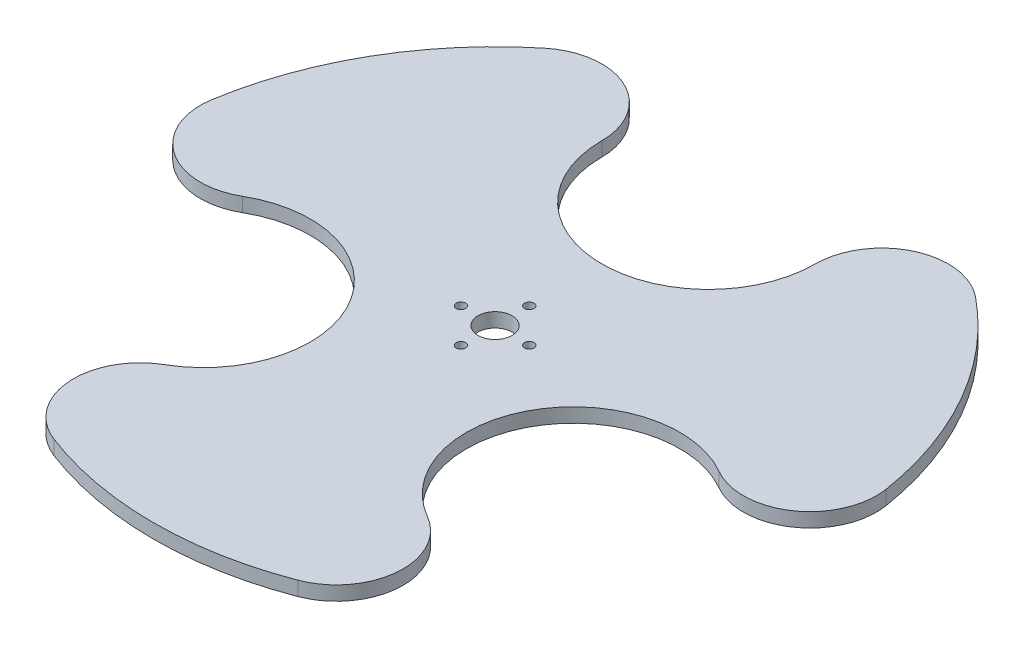
ISO-10303-21;
HEADER;
FILE_DESCRIPTION(('STEP AP214'),'2;1');
FILE_NAME('part.step','',(''),(''),'','','');
FILE_SCHEMA(('AUTOMOTIVE_DESIGN { 1 0 10303 214 1 1 1 1 }'));
ENDSEC;
DATA;
#1=APPLICATION_CONTEXT('core data for automotive mechanical design processes');
#2=APPLICATION_PROTOCOL_DEFINITION('international standard','automotive_design',2000,#1);
#3=PRODUCT_CONTEXT('',#1,'mechanical');
#4=PRODUCT('Part','Part','',(#3));
#5=PRODUCT_RELATED_PRODUCT_CATEGORY('part','',(#4));
#6=PRODUCT_DEFINITION_FORMATION('','',#4);
#7=PRODUCT_DEFINITION_CONTEXT('part definition',#1,'design');
#8=PRODUCT_DEFINITION('design','',#6,#7);
#9=PRODUCT_DEFINITION_SHAPE('','',#8);
#10=(LENGTH_UNIT() NAMED_UNIT(*) SI_UNIT(.MILLI.,.METRE.));
#11=(NAMED_UNIT(*) PLANE_ANGLE_UNIT() SI_UNIT($,.RADIAN.));
#12=(NAMED_UNIT(*) SI_UNIT($,.STERADIAN.) SOLID_ANGLE_UNIT());
#13=UNCERTAINTY_MEASURE_WITH_UNIT(LENGTH_MEASURE(1.E-05),#10,'distance_accuracy_value','');
#14=(GEOMETRIC_REPRESENTATION_CONTEXT(3) GLOBAL_UNCERTAINTY_ASSIGNED_CONTEXT((#13)) GLOBAL_UNIT_ASSIGNED_CONTEXT((#10,
#11,#12)) REPRESENTATION_CONTEXT('',''));
#15=CARTESIAN_POINT('',(0.,0.,0.));
#16=DIRECTION('',(0.,0.,1.));
#17=DIRECTION('',(1.,0.,0.));
#18=AXIS2_PLACEMENT_3D('',#15,#16,#17);
#19=CARTESIAN_POINT('',(0.,-5.,0.));
#20=DIRECTION('',(0.,1.,0.));
#21=DIRECTION('',(0.,0.,1.));
#22=AXIS2_PLACEMENT_3D('',#19,#20,#21);
#23=CYLINDRICAL_SURFACE('',#22,120.);
#24=CARTESIAN_POINT('',(0.,0.,0.));
#25=DIRECTION('',(0.,1.,0.));
#26=DIRECTION('',(0.,0.,1.));
#27=AXIS2_PLACEMENT_3D('',#24,#25,#26);
#28=CIRCLE('',#27,120.);
#29=CARTESIAN_POINT('',(-75.6377079482441,0.,-93.1608133086874));
#30=VERTEX_POINT('',#29);
#31=CARTESIAN_POINT('',(-118.498484936665,0.,-18.9237699128637));
#32=VERTEX_POINT('',#31);
#33=EDGE_CURVE('E166',#30,#32,#28,.T.);
#34=ORIENTED_EDGE('',*,*,#33,.F.);
#35=DIRECTION('',(0.,1.,0.));
#36=VECTOR('',#35,1.);
#37=CARTESIAN_POINT('',(-75.6377079482441,-5.,-93.1608133086874));
#38=LINE('',#37,#36);
#39=CARTESIAN_POINT('',(-75.6377079482441,-5.,-93.1608133086874));
#40=VERTEX_POINT('',#39);
#41=EDGE_CURVE('E11',#40,#30,#38,.T.);
#42=ORIENTED_EDGE('',*,*,#41,.F.);
#43=CARTESIAN_POINT('',(0.,-5.,0.));
#44=DIRECTION('',(0.,1.,0.));
#45=DIRECTION('',(0.,0.,1.));
#46=AXIS2_PLACEMENT_3D('',#43,#44,#45);
#47=CIRCLE('',#46,120.);
#48=CARTESIAN_POINT('',(-118.498484936665,-5.,-18.9237699128637));
#49=VERTEX_POINT('',#48);
#50=EDGE_CURVE('E217',#40,#49,#47,.T.);
#51=ORIENTED_EDGE('',*,*,#50,.T.);
#52=DIRECTION('',(0.,1.,0.));
#53=VECTOR('',#52,1.);
#54=CARTESIAN_POINT('',(-118.498484936665,-5.,-18.9237699128637));
#55=LINE('',#54,#53);
#56=EDGE_CURVE('E43',#49,#32,#55,.T.);
#57=ORIENTED_EDGE('',*,*,#56,.T.);
#58=EDGE_LOOP('',(#34,#42,#51,#57));
#59=FACE_BOUND('',#58,.T.);
#60=ADVANCED_FACE('F39',(#59),#23,.T.);
#61=CARTESIAN_POINT('',(-60.8928571428574,-5.,-75.));
#62=DIRECTION('',(0.,1.,0.));
#63=DIRECTION('',(0.,0.,1.));
#64=AXIS2_PLACEMENT_3D('',#61,#62,#63);
#65=CYLINDRICAL_SURFACE('',#64,23.3928571428571);
#66=CARTESIAN_POINT('',(-60.8928571428574,0.,-75.));
#67=DIRECTION('',(0.,1.,0.));
#68=DIRECTION('',(0.,0.,1.));
#69=AXIS2_PLACEMENT_3D('',#66,#67,#68);
#70=CIRCLE('',#69,23.3928571428571);
#71=CARTESIAN_POINT('',(-37.5,0.,-75.));
#72=VERTEX_POINT('',#71);
#73=EDGE_CURVE('E197',#30,#72,#70,.F.);
#74=ORIENTED_EDGE('',*,*,#73,.T.);
#75=DIRECTION('',(0.,1.,0.));
#76=VECTOR('',#75,1.);
#77=CARTESIAN_POINT('',(-37.5,-5.,-75.));
#78=LINE('',#77,#76);
#79=CARTESIAN_POINT('',(-37.5,-5.,-75.));
#80=VERTEX_POINT('',#79);
#81=EDGE_CURVE('E49',#80,#72,#78,.T.);
#82=ORIENTED_EDGE('',*,*,#81,.F.);
#83=CARTESIAN_POINT('',(-60.8928571428574,-5.,-75.));
#84=DIRECTION('',(0.,1.,0.));
#85=DIRECTION('',(0.,0.,1.));
#86=AXIS2_PLACEMENT_3D('',#83,#84,#85);
#87=CIRCLE('',#86,23.3928571428571);
#88=EDGE_CURVE('E145',#40,#80,#87,.F.);
#89=ORIENTED_EDGE('',*,*,#88,.F.);
#90=ORIENTED_EDGE('',*,*,#41,.T.);
#91=EDGE_LOOP('',(#74,#82,#89,#90));
#92=FACE_BOUND('',#91,.T.);
#93=ADVANCED_FACE('F220',(#92),#65,.T.);
#94=CARTESIAN_POINT('',(0.,-5.,-75.));
#95=DIRECTION('',(0.,1.,0.));
#96=DIRECTION('',(0.,0.,1.));
#97=AXIS2_PLACEMENT_3D('',#94,#95,#96);
#98=CYLINDRICAL_SURFACE('',#97,37.5);
#99=CARTESIAN_POINT('',(0.,0.,-75.));
#100=DIRECTION('',(0.,1.,0.));
#101=DIRECTION('',(0.,0.,1.));
#102=AXIS2_PLACEMENT_3D('',#99,#100,#101);
#103=CIRCLE('',#102,37.5);
#104=CARTESIAN_POINT('',(37.5,0.,-75.));
#105=VERTEX_POINT('',#104);
#106=EDGE_CURVE('E98',#72,#105,#103,.T.);
#107=ORIENTED_EDGE('',*,*,#106,.T.);
#108=DIRECTION('',(0.,1.,0.));
#109=VECTOR('',#108,1.);
#110=CARTESIAN_POINT('',(37.5,-5.,-75.));
#111=LINE('',#110,#109);
#112=CARTESIAN_POINT('',(37.5,-5.,-75.));
#113=VERTEX_POINT('',#112);
#114=EDGE_CURVE('E149',#113,#105,#111,.T.);
#115=ORIENTED_EDGE('',*,*,#114,.F.);
#116=CARTESIAN_POINT('',(0.,-5.,-75.));
#117=DIRECTION('',(0.,1.,0.));
#118=DIRECTION('',(0.,0.,1.));
#119=AXIS2_PLACEMENT_3D('',#116,#117,#118);
#120=CIRCLE('',#119,37.5);
#121=EDGE_CURVE('E137',#80,#113,#120,.T.);
#122=ORIENTED_EDGE('',*,*,#121,.F.);
#123=ORIENTED_EDGE('',*,*,#81,.T.);
#124=EDGE_LOOP('',(#107,#115,#122,#123));
#125=FACE_BOUND('',#124,.T.);
#126=ADVANCED_FACE('F150',(#125),#98,.F.);
#127=CARTESIAN_POINT('',(60.8928571428572,-5.,-75.));
#128=DIRECTION('',(0.,1.,0.));
#129=DIRECTION('',(0.,0.,1.));
#130=AXIS2_PLACEMENT_3D('',#127,#128,#129);
#131=CYLINDRICAL_SURFACE('',#130,23.3928571428571);
#132=CARTESIAN_POINT('',(60.8928571428572,0.,-75.));
#133=DIRECTION('',(0.,1.,0.));
#134=DIRECTION('',(0.,0.,1.));
#135=AXIS2_PLACEMENT_3D('',#132,#133,#134);
#136=CIRCLE('',#135,23.3928571428571);
#137=CARTESIAN_POINT('',(75.637707948244,0.,-93.1608133086876));
#138=VERTEX_POINT('',#137);
#139=EDGE_CURVE('E194',#138,#105,#136,.T.);
#140=ORIENTED_EDGE('',*,*,#139,.F.);
#141=DIRECTION('',(0.,1.,0.));
#142=VECTOR('',#141,1.);
#143=CARTESIAN_POINT('',(75.637707948244,-5.,-93.1608133086876));
#144=LINE('',#143,#142);
#145=CARTESIAN_POINT('',(75.637707948244,-5.,-93.1608133086876));
#146=VERTEX_POINT('',#145);
#147=EDGE_CURVE('E153',#146,#138,#144,.T.);
#148=ORIENTED_EDGE('',*,*,#147,.F.);
#149=CARTESIAN_POINT('',(60.8928571428572,-5.,-75.));
#150=DIRECTION('',(0.,1.,0.));
#151=DIRECTION('',(0.,0.,1.));
#152=AXIS2_PLACEMENT_3D('',#149,#150,#151);
#153=CIRCLE('',#152,23.3928571428571);
#154=EDGE_CURVE('E143',#146,#113,#153,.T.);
#155=ORIENTED_EDGE('',*,*,#154,.T.);
#156=ORIENTED_EDGE('',*,*,#114,.T.);
#157=EDGE_LOOP('',(#140,#148,#155,#156));
#158=FACE_BOUND('',#157,.T.);
#159=ADVANCED_FACE('F155',(#158),#131,.T.);
#160=CARTESIAN_POINT('',(0.,-5.,0.));
#161=DIRECTION('',(0.,1.,0.));
#162=DIRECTION('',(0.,0.,1.));
#163=AXIS2_PLACEMENT_3D('',#160,#161,#162);
#164=CYLINDRICAL_SURFACE('',#163,120.);
#165=CARTESIAN_POINT('',(0.,0.,0.));
#166=DIRECTION('',(0.,1.,0.));
#167=DIRECTION('',(0.,0.,1.));
#168=AXIS2_PLACEMENT_3D('',#165,#166,#167);
#169=CIRCLE('',#168,120.);
#170=CARTESIAN_POINT('',(118.498484936665,0.,-18.9237699128639));
#171=VERTEX_POINT('',#170);
#172=EDGE_CURVE('E191',#171,#138,#169,.T.);
#173=ORIENTED_EDGE('',*,*,#172,.F.);
#174=DIRECTION('',(0.,1.,0.));
#175=VECTOR('',#174,1.);
#176=CARTESIAN_POINT('',(118.498484936665,-5.,-18.9237699128639));
#177=LINE('',#176,#175);
#178=CARTESIAN_POINT('',(118.498484936665,-5.,-18.9237699128639));
#179=VERTEX_POINT('',#178);
#180=EDGE_CURVE('E202',#179,#171,#177,.T.);
#181=ORIENTED_EDGE('',*,*,#180,.F.);
#182=CARTESIAN_POINT('',(0.,-5.,0.));
#183=DIRECTION('',(0.,1.,0.));
#184=DIRECTION('',(0.,0.,1.));
#185=AXIS2_PLACEMENT_3D('',#182,#183,#184);
#186=CIRCLE('',#185,120.);
#187=EDGE_CURVE('E156',#179,#146,#186,.T.);
#188=ORIENTED_EDGE('',*,*,#187,.T.);
#189=ORIENTED_EDGE('',*,*,#147,.T.);
#190=EDGE_LOOP('',(#173,#181,#188,#189));
#191=FACE_BOUND('',#190,.T.);
#192=ADVANCED_FACE('F266',(#191),#164,.T.);
#193=CARTESIAN_POINT('',(95.3983338552616,-5.,-15.2347611947313));
#194=DIRECTION('',(0.,1.,0.));
#195=DIRECTION('',(0.,0.,1.));
#196=AXIS2_PLACEMENT_3D('',#193,#194,#195);
#197=CYLINDRICAL_SURFACE('',#196,23.3928571428571);
#198=CARTESIAN_POINT('',(95.3983338552616,0.,-15.2347611947313));
#199=DIRECTION('',(0.,1.,0.));
#200=DIRECTION('',(0.,0.,1.));
#201=AXIS2_PLACEMENT_3D('',#198,#199,#200);
#202=CIRCLE('',#201,23.3928571428571);
#203=CARTESIAN_POINT('',(83.7019052838329,0.,5.02404735808354));
#204=VERTEX_POINT('',#203);
#205=EDGE_CURVE('E188',#171,#204,#202,.F.);
#206=ORIENTED_EDGE('',*,*,#205,.T.);
#207=DIRECTION('',(0.,1.,0.));
#208=VECTOR('',#207,1.);
#209=CARTESIAN_POINT('',(83.7019052838329,-5.,5.02404735808354));
#210=LINE('',#209,#208);
#211=CARTESIAN_POINT('',(83.7019052838329,-5.,5.02404735808354));
#212=VERTEX_POINT('',#211);
#213=EDGE_CURVE('E204',#212,#204,#210,.T.);
#214=ORIENTED_EDGE('',*,*,#213,.F.);
#215=CARTESIAN_POINT('',(95.3983338552616,-5.,-15.2347611947313));
#216=DIRECTION('',(0.,1.,0.));
#217=DIRECTION('',(0.,0.,1.));
#218=AXIS2_PLACEMENT_3D('',#215,#216,#217);
#219=CIRCLE('',#218,23.3928571428571);
#220=EDGE_CURVE('E158',#179,#212,#219,.F.);
#221=ORIENTED_EDGE('',*,*,#220,.F.);
#222=ORIENTED_EDGE('',*,*,#180,.T.);
#223=EDGE_LOOP('',(#206,#214,#221,#222));
#224=FACE_BOUND('',#223,.T.);
#225=ADVANCED_FACE('F246',(#224),#197,.T.);
#226=CARTESIAN_POINT('',(64.9519052838329,-5.,37.5));
#227=DIRECTION('',(0.,1.,0.));
#228=DIRECTION('',(0.,0.,1.));
#229=AXIS2_PLACEMENT_3D('',#226,#227,#228);
#230=CYLINDRICAL_SURFACE('',#229,37.5);
#231=CARTESIAN_POINT('',(64.9519052838329,0.,37.5));
#232=DIRECTION('',(0.,1.,0.));
#233=DIRECTION('',(0.,0.,1.));
#234=AXIS2_PLACEMENT_3D('',#231,#232,#233);
#235=CIRCLE('',#234,37.5);
#236=CARTESIAN_POINT('',(46.2019052838329,0.,69.9759526419165));
#237=VERTEX_POINT('',#236);
#238=EDGE_CURVE('E185',#204,#237,#235,.T.);
#239=ORIENTED_EDGE('',*,*,#238,.T.);
#240=DIRECTION('',(0.,1.,0.));
#241=VECTOR('',#240,1.);
#242=CARTESIAN_POINT('',(46.2019052838329,-5.,69.9759526419165));
#243=LINE('',#242,#241);
#244=CARTESIAN_POINT('',(46.2019052838329,-5.,69.9759526419165));
#245=VERTEX_POINT('',#244);
#246=EDGE_CURVE('E207',#245,#237,#243,.T.);
#247=ORIENTED_EDGE('',*,*,#246,.F.);
#248=CARTESIAN_POINT('',(64.9519052838329,-5.,37.5));
#249=DIRECTION('',(0.,1.,0.));
#250=DIRECTION('',(0.,0.,1.));
#251=AXIS2_PLACEMENT_3D('',#248,#249,#250);
#252=CIRCLE('',#251,37.5);
#253=EDGE_CURVE('E239',#212,#245,#252,.T.);
#254=ORIENTED_EDGE('',*,*,#253,.F.);
#255=ORIENTED_EDGE('',*,*,#213,.T.);
#256=EDGE_LOOP('',(#239,#247,#254,#255));
#257=FACE_BOUND('',#256,.T.);
#258=ADVANCED_FACE('F249',(#257),#230,.F.);
#259=CARTESIAN_POINT('',(34.5054767124043,-5.,90.234761194731));
#260=DIRECTION('',(0.,1.,0.));
#261=DIRECTION('',(0.,0.,1.));
#262=AXIS2_PLACEMENT_3D('',#259,#260,#261);
#263=CYLINDRICAL_SURFACE('',#262,23.3928571428571);
#264=CARTESIAN_POINT('',(34.5054767124043,0.,90.234761194731));
#265=DIRECTION('',(0.,1.,0.));
#266=DIRECTION('',(0.,0.,1.));
#267=AXIS2_PLACEMENT_3D('',#264,#265,#266);
#268=CIRCLE('',#267,23.3928571428571);
#269=CARTESIAN_POINT('',(42.8607769884209,0.,112.084583221551));
#270=VERTEX_POINT('',#269);
#271=EDGE_CURVE('E182',#270,#237,#268,.T.);
#272=ORIENTED_EDGE('',*,*,#271,.F.);
#273=DIRECTION('',(0.,1.,0.));
#274=VECTOR('',#273,1.);
#275=CARTESIAN_POINT('',(42.8607769884209,-5.,112.084583221551));
#276=LINE('',#275,#274);
#277=CARTESIAN_POINT('',(42.8607769884209,-5.,112.084583221551));
#278=VERTEX_POINT('',#277);
#279=EDGE_CURVE('E209',#278,#270,#276,.T.);
#280=ORIENTED_EDGE('',*,*,#279,.F.);
#281=CARTESIAN_POINT('',(34.5054767124043,-5.,90.234761194731));
#282=DIRECTION('',(0.,1.,0.));
#283=DIRECTION('',(0.,0.,1.));
#284=AXIS2_PLACEMENT_3D('',#281,#282,#283);
#285=CIRCLE('',#284,23.3928571428571);
#286=EDGE_CURVE('E236',#278,#245,#285,.T.);
#287=ORIENTED_EDGE('',*,*,#286,.T.);
#288=ORIENTED_EDGE('',*,*,#246,.T.);
#289=EDGE_LOOP('',(#272,#280,#287,#288));
#290=FACE_BOUND('',#289,.T.);
#291=ADVANCED_FACE('F252',(#290),#263,.T.);
#292=CARTESIAN_POINT('',(0.,-5.,0.));
#293=DIRECTION('',(0.,1.,0.));
#294=DIRECTION('',(0.,0.,1.));
#295=AXIS2_PLACEMENT_3D('',#292,#293,#294);
#296=CYLINDRICAL_SURFACE('',#295,120.);
#297=CARTESIAN_POINT('',(0.,0.,0.));
#298=DIRECTION('',(0.,1.,0.));
#299=DIRECTION('',(0.,0.,1.));
#300=AXIS2_PLACEMENT_3D('',#297,#298,#299);
#301=CIRCLE('',#300,120.);
#302=CARTESIAN_POINT('',(-42.8607769884206,0.,112.084583221551));
#303=VERTEX_POINT('',#302);
#304=EDGE_CURVE('E179',#303,#270,#301,.T.);
#305=ORIENTED_EDGE('',*,*,#304,.F.);
#306=DIRECTION('',(0.,1.,0.));
#307=VECTOR('',#306,1.);
#308=CARTESIAN_POINT('',(-42.8607769884206,-5.,112.084583221551));
#309=LINE('',#308,#307);
#310=CARTESIAN_POINT('',(-42.8607769884206,-5.,112.084583221551));
#311=VERTEX_POINT('',#310);
#312=EDGE_CURVE('E211',#311,#303,#309,.T.);
#313=ORIENTED_EDGE('',*,*,#312,.F.);
#314=CARTESIAN_POINT('',(0.,-5.,0.));
#315=DIRECTION('',(0.,1.,0.));
#316=DIRECTION('',(0.,0.,1.));
#317=AXIS2_PLACEMENT_3D('',#314,#315,#316);
#318=CIRCLE('',#317,120.);
#319=EDGE_CURVE('E233',#311,#278,#318,.T.);
#320=ORIENTED_EDGE('',*,*,#319,.T.);
#321=ORIENTED_EDGE('',*,*,#279,.T.);
#322=EDGE_LOOP('',(#305,#313,#320,#321));
#323=FACE_BOUND('',#322,.T.);
#324=ADVANCED_FACE('F256',(#323),#296,.T.);
#325=CARTESIAN_POINT('',(-34.5054767124041,-5.,90.2347611947312));
#326=DIRECTION('',(0.,1.,0.));
#327=DIRECTION('',(0.,0.,1.));
#328=AXIS2_PLACEMENT_3D('',#325,#326,#327);
#329=CYLINDRICAL_SURFACE('',#328,23.3928571428571);
#330=CARTESIAN_POINT('',(-34.5054767124041,0.,90.2347611947312));
#331=DIRECTION('',(0.,1.,0.));
#332=DIRECTION('',(0.,0.,1.));
#333=AXIS2_PLACEMENT_3D('',#330,#331,#332);
#334=CIRCLE('',#333,23.3928571428571);
#335=CARTESIAN_POINT('',(-46.2019052838329,0.,69.9759526419165));
#336=VERTEX_POINT('',#335);
#337=EDGE_CURVE('E176',#303,#336,#334,.F.);
#338=ORIENTED_EDGE('',*,*,#337,.T.);
#339=DIRECTION('',(0.,1.,0.));
#340=VECTOR('',#339,1.);
#341=CARTESIAN_POINT('',(-46.2019052838329,-5.,69.9759526419165));
#342=LINE('',#341,#340);
#343=CARTESIAN_POINT('',(-46.2019052838329,-5.,69.9759526419165));
#344=VERTEX_POINT('',#343);
#345=EDGE_CURVE('E213',#344,#336,#342,.T.);
#346=ORIENTED_EDGE('',*,*,#345,.F.);
#347=CARTESIAN_POINT('',(-34.5054767124041,-5.,90.2347611947312));
#348=DIRECTION('',(0.,1.,0.));
#349=DIRECTION('',(0.,0.,1.));
#350=AXIS2_PLACEMENT_3D('',#347,#348,#349);
#351=CIRCLE('',#350,23.3928571428571);
#352=EDGE_CURVE('E230',#311,#344,#351,.F.);
#353=ORIENTED_EDGE('',*,*,#352,.F.);
#354=ORIENTED_EDGE('',*,*,#312,.T.);
#355=EDGE_LOOP('',(#338,#346,#353,#354));
#356=FACE_BOUND('',#355,.T.);
#357=ADVANCED_FACE('F261',(#356),#329,.T.);
#358=CARTESIAN_POINT('',(-64.9519052838329,-5.,37.5));
#359=DIRECTION('',(0.,1.,0.));
#360=DIRECTION('',(0.,0.,1.));
#361=AXIS2_PLACEMENT_3D('',#358,#359,#360);
#362=CYLINDRICAL_SURFACE('',#361,37.5);
#363=CARTESIAN_POINT('',(-64.9519052838329,0.,37.5));
#364=DIRECTION('',(0.,1.,0.));
#365=DIRECTION('',(0.,0.,1.));
#366=AXIS2_PLACEMENT_3D('',#363,#364,#365);
#367=CIRCLE('',#366,37.5);
#368=CARTESIAN_POINT('',(-83.7019052838329,0.,5.02404735808358));
#369=VERTEX_POINT('',#368);
#370=EDGE_CURVE('E173',#336,#369,#367,.T.);
#371=ORIENTED_EDGE('',*,*,#370,.T.);
#372=DIRECTION('',(0.,1.,0.));
#373=VECTOR('',#372,1.);
#374=CARTESIAN_POINT('',(-83.7019052838329,-5.,5.02404735808358));
#375=LINE('',#374,#373);
#376=CARTESIAN_POINT('',(-83.7019052838329,-5.,5.02404735808358));
#377=VERTEX_POINT('',#376);
#378=EDGE_CURVE('E215',#377,#369,#375,.T.);
#379=ORIENTED_EDGE('',*,*,#378,.F.);
#380=CARTESIAN_POINT('',(-64.9519052838329,-5.,37.5));
#381=DIRECTION('',(0.,1.,0.));
#382=DIRECTION('',(0.,0.,1.));
#383=AXIS2_PLACEMENT_3D('',#380,#381,#382);
#384=CIRCLE('',#383,37.5);
#385=EDGE_CURVE('E223',#344,#377,#384,.T.);
#386=ORIENTED_EDGE('',*,*,#385,.F.);
#387=ORIENTED_EDGE('',*,*,#345,.T.);
#388=EDGE_LOOP('',(#371,#379,#386,#387));
#389=FACE_BOUND('',#388,.T.);
#390=ADVANCED_FACE('F263',(#389),#362,.F.);
#391=CARTESIAN_POINT('',(0.,-5.,0.));
#392=DIRECTION('',(0.,1.,0.));
#393=DIRECTION('',(0.,0.,1.));
#394=AXIS2_PLACEMENT_3D('',#391,#392,#393);
#395=CYLINDRICAL_SURFACE('',#394,6.);
#396=CARTESIAN_POINT('',(0.,-5.,0.));
#397=DIRECTION('',(0.,1.,0.));
#398=DIRECTION('',(0.,0.,1.));
#399=AXIS2_PLACEMENT_3D('',#396,#397,#398);
#400=CIRCLE('',#399,6.);
#401=CARTESIAN_POINT('',(0.,-5.,6.));
#402=VERTEX_POINT('',#401);
#403=EDGE_CURVE('E198',#402,#402,#400,.T.);
#404=ORIENTED_EDGE('',*,*,#403,.F.);
#405=EDGE_LOOP('',(#404));
#406=FACE_BOUND('',#405,.T.);
#407=CARTESIAN_POINT('',(0.,0.,0.));
#408=DIRECTION('',(0.,1.,0.));
#409=DIRECTION('',(0.,0.,1.));
#410=AXIS2_PLACEMENT_3D('',#407,#408,#409);
#411=CIRCLE('',#410,6.);
#412=CARTESIAN_POINT('',(0.,0.,6.));
#413=VERTEX_POINT('',#412);
#414=EDGE_CURVE('E163',#413,#413,#411,.T.);
#415=ORIENTED_EDGE('',*,*,#414,.T.);
#416=EDGE_LOOP('',(#415));
#417=FACE_BOUND('',#416,.T.);
#418=ADVANCED_FACE('F41',(#406,#417),#395,.F.);
#419=CARTESIAN_POINT('',(-95.3983338552615,-5.,-15.234761194731));
#420=DIRECTION('',(0.,1.,0.));
#421=DIRECTION('',(0.,0.,1.));
#422=AXIS2_PLACEMENT_3D('',#419,#420,#421);
#423=CYLINDRICAL_SURFACE('',#422,23.3928571428571);
#424=CARTESIAN_POINT('',(-95.3983338552615,0.,-15.234761194731));
#425=DIRECTION('',(0.,1.,0.));
#426=DIRECTION('',(0.,0.,1.));
#427=AXIS2_PLACEMENT_3D('',#424,#425,#426);
#428=CIRCLE('',#427,23.3928571428571);
#429=EDGE_CURVE('E170',#32,#369,#428,.T.);
#430=ORIENTED_EDGE('',*,*,#429,.F.);
#431=ORIENTED_EDGE('',*,*,#56,.F.);
#432=CARTESIAN_POINT('',(-95.3983338552615,-5.,-15.234761194731));
#433=DIRECTION('',(0.,1.,0.));
#434=DIRECTION('',(0.,0.,1.));
#435=AXIS2_PLACEMENT_3D('',#432,#433,#434);
#436=CIRCLE('',#435,23.3928571428571);
#437=EDGE_CURVE('E221',#49,#377,#436,.T.);
#438=ORIENTED_EDGE('',*,*,#437,.T.);
#439=ORIENTED_EDGE('',*,*,#378,.T.);
#440=EDGE_LOOP('',(#430,#431,#438,#439));
#441=FACE_BOUND('',#440,.T.);
#442=ADVANCED_FACE('F218',(#441),#423,.T.);
#443=CARTESIAN_POINT('',(0.,-5.,0.));
#444=DIRECTION('',(0.,1.,0.));
#445=DIRECTION('',(0.,0.,1.));
#446=AXIS2_PLACEMENT_3D('',#443,#444,#445);
#447=PLANE('',#446);
#448=CARTESIAN_POINT('',(0.,-5.,-12.));
#449=DIRECTION('',(0.,1.,0.));
#450=DIRECTION('',(0.,0.,1.));
#451=AXIS2_PLACEMENT_3D('',#448,#449,#450);
#452=CIRCLE('',#451,1.65);
#453=CARTESIAN_POINT('',(0.,-5.,-10.35));
#454=VERTEX_POINT('',#453);
#455=EDGE_CURVE('E463',#454,#454,#452,.T.);
#456=ORIENTED_EDGE('',*,*,#455,.T.);
#457=EDGE_LOOP('',(#456));
#458=FACE_BOUND('',#457,.T.);
#459=CARTESIAN_POINT('',(12.,-5.,0.));
#460=DIRECTION('',(0.,1.,0.));
#461=DIRECTION('',(0.,0.,1.));
#462=AXIS2_PLACEMENT_3D('',#459,#460,#461);
#463=CIRCLE('',#462,1.65);
#464=CARTESIAN_POINT('',(12.,-5.,1.64999999999999));
#465=VERTEX_POINT('',#464);
#466=EDGE_CURVE('E473',#465,#465,#463,.T.);
#467=ORIENTED_EDGE('',*,*,#466,.T.);
#468=EDGE_LOOP('',(#467));
#469=FACE_BOUND('',#468,.T.);
#470=CARTESIAN_POINT('',(0.,-5.,12.));
#471=DIRECTION('',(0.,1.,0.));
#472=DIRECTION('',(0.,0.,1.));
#473=AXIS2_PLACEMENT_3D('',#470,#471,#472);
#474=CIRCLE('',#473,1.65);
#475=CARTESIAN_POINT('',(0.,-5.,13.65));
#476=VERTEX_POINT('',#475);
#477=EDGE_CURVE('E479',#476,#476,#474,.T.);
#478=ORIENTED_EDGE('',*,*,#477,.T.);
#479=EDGE_LOOP('',(#478));
#480=FACE_BOUND('',#479,.T.);
#481=CARTESIAN_POINT('',(-12.,-5.,0.));
#482=DIRECTION('',(0.,1.,0.));
#483=DIRECTION('',(0.,0.,1.));
#484=AXIS2_PLACEMENT_3D('',#481,#482,#483);
#485=CIRCLE('',#484,1.65);
#486=CARTESIAN_POINT('',(-12.,-5.,1.65));
#487=VERTEX_POINT('',#486);
#488=EDGE_CURVE('E167',#487,#487,#485,.T.);
#489=ORIENTED_EDGE('',*,*,#488,.T.);
#490=EDGE_LOOP('',(#489));
#491=FACE_BOUND('',#490,.T.);
#492=ORIENTED_EDGE('',*,*,#403,.T.);
#493=EDGE_LOOP('',(#492));
#494=FACE_BOUND('',#493,.T.);
#495=ORIENTED_EDGE('',*,*,#50,.F.);
#496=ORIENTED_EDGE('',*,*,#88,.T.);
#497=ORIENTED_EDGE('',*,*,#121,.T.);
#498=ORIENTED_EDGE('',*,*,#154,.F.);
#499=ORIENTED_EDGE('',*,*,#187,.F.);
#500=ORIENTED_EDGE('',*,*,#220,.T.);
#501=ORIENTED_EDGE('',*,*,#253,.T.);
#502=ORIENTED_EDGE('',*,*,#286,.F.);
#503=ORIENTED_EDGE('',*,*,#319,.F.);
#504=ORIENTED_EDGE('',*,*,#352,.T.);
#505=ORIENTED_EDGE('',*,*,#385,.T.);
#506=ORIENTED_EDGE('',*,*,#437,.F.);
#507=EDGE_LOOP('',(#495,#496,#497,#498,#499,#500,#501,#502,#503,#504,#505,#506));
#508=FACE_BOUND('',#507,.T.);
#509=ADVANCED_FACE('F140',(#458,#469,#480,#491,#494,#508),#447,.F.);
#510=CARTESIAN_POINT('',(0.,0.,0.));
#511=DIRECTION('',(0.,1.,0.));
#512=DIRECTION('',(0.,0.,1.));
#513=AXIS2_PLACEMENT_3D('',#510,#511,#512);
#514=PLANE('',#513);
#515=CARTESIAN_POINT('',(0.,0.,-12.));
#516=DIRECTION('',(0.,1.,0.));
#517=DIRECTION('',(0.,0.,1.));
#518=AXIS2_PLACEMENT_3D('',#515,#516,#517);
#519=CIRCLE('',#518,1.65);
#520=CARTESIAN_POINT('',(0.,0.,-10.35));
#521=VERTEX_POINT('',#520);
#522=EDGE_CURVE('E466',#521,#521,#519,.T.);
#523=ORIENTED_EDGE('',*,*,#522,.F.);
#524=EDGE_LOOP('',(#523));
#525=FACE_BOUND('',#524,.T.);
#526=CARTESIAN_POINT('',(12.,0.,0.));
#527=DIRECTION('',(0.,1.,0.));
#528=DIRECTION('',(0.,0.,1.));
#529=AXIS2_PLACEMENT_3D('',#526,#527,#528);
#530=CIRCLE('',#529,1.65);
#531=CARTESIAN_POINT('',(12.,0.,1.64999999999999));
#532=VERTEX_POINT('',#531);
#533=EDGE_CURVE('E468',#532,#532,#530,.T.);
#534=ORIENTED_EDGE('',*,*,#533,.F.);
#535=EDGE_LOOP('',(#534));
#536=FACE_BOUND('',#535,.T.);
#537=CARTESIAN_POINT('',(0.,0.,12.));
#538=DIRECTION('',(0.,1.,0.));
#539=DIRECTION('',(0.,0.,1.));
#540=AXIS2_PLACEMENT_3D('',#537,#538,#539);
#541=CIRCLE('',#540,1.65);
#542=CARTESIAN_POINT('',(0.,0.,13.65));
#543=VERTEX_POINT('',#542);
#544=EDGE_CURVE('E476',#543,#543,#541,.T.);
#545=ORIENTED_EDGE('',*,*,#544,.F.);
#546=EDGE_LOOP('',(#545));
#547=FACE_BOUND('',#546,.T.);
#548=CARTESIAN_POINT('',(-12.,0.,0.));
#549=DIRECTION('',(0.,1.,0.));
#550=DIRECTION('',(0.,0.,1.));
#551=AXIS2_PLACEMENT_3D('',#548,#549,#550);
#552=CIRCLE('',#551,1.65);
#553=CARTESIAN_POINT('',(-12.,0.,1.65));
#554=VERTEX_POINT('',#553);
#555=EDGE_CURVE('E482',#554,#554,#552,.T.);
#556=ORIENTED_EDGE('',*,*,#555,.F.);
#557=EDGE_LOOP('',(#556));
#558=FACE_BOUND('',#557,.T.);
#559=ORIENTED_EDGE('',*,*,#414,.F.);
#560=EDGE_LOOP('',(#559));
#561=FACE_BOUND('',#560,.T.);
#562=ORIENTED_EDGE('',*,*,#33,.T.);
#563=ORIENTED_EDGE('',*,*,#429,.T.);
#564=ORIENTED_EDGE('',*,*,#370,.F.);
#565=ORIENTED_EDGE('',*,*,#337,.F.);
#566=ORIENTED_EDGE('',*,*,#304,.T.);
#567=ORIENTED_EDGE('',*,*,#271,.T.);
#568=ORIENTED_EDGE('',*,*,#238,.F.);
#569=ORIENTED_EDGE('',*,*,#205,.F.);
#570=ORIENTED_EDGE('',*,*,#172,.T.);
#571=ORIENTED_EDGE('',*,*,#139,.T.);
#572=ORIENTED_EDGE('',*,*,#106,.F.);
#573=ORIENTED_EDGE('',*,*,#73,.F.);
#574=EDGE_LOOP('',(#562,#563,#564,#565,#566,#567,#568,#569,#570,#571,#572,#573));
#575=FACE_BOUND('',#574,.T.);
#576=ADVANCED_FACE('F219',(#525,#536,#547,#558,#561,#575),#514,.T.);
#577=CARTESIAN_POINT('',(-12.,0.,0.));
#578=DIRECTION('',(0.,1.,0.));
#579=DIRECTION('',(0.,0.,1.));
#580=AXIS2_PLACEMENT_3D('',#577,#578,#579);
#581=CYLINDRICAL_SURFACE('',#580,1.65);
#582=ORIENTED_EDGE('',*,*,#488,.F.);
#583=EDGE_LOOP('',(#582));
#584=FACE_BOUND('',#583,.T.);
#585=ORIENTED_EDGE('',*,*,#555,.T.);
#586=EDGE_LOOP('',(#585));
#587=FACE_BOUND('',#586,.T.);
#588=ADVANCED_FACE('F336',(#584,#587),#581,.F.);
#589=CARTESIAN_POINT('',(0.,0.,12.));
#590=DIRECTION('',(0.,1.,0.));
#591=DIRECTION('',(0.,0.,1.));
#592=AXIS2_PLACEMENT_3D('',#589,#590,#591);
#593=CYLINDRICAL_SURFACE('',#592,1.65);
#594=ORIENTED_EDGE('',*,*,#477,.F.);
#595=EDGE_LOOP('',(#594));
#596=FACE_BOUND('',#595,.T.);
#597=ORIENTED_EDGE('',*,*,#544,.T.);
#598=EDGE_LOOP('',(#597));
#599=FACE_BOUND('',#598,.T.);
#600=ADVANCED_FACE('F345',(#596,#599),#593,.F.);
#601=CARTESIAN_POINT('',(12.,0.,0.));
#602=DIRECTION('',(0.,1.,0.));
#603=DIRECTION('',(0.,0.,1.));
#604=AXIS2_PLACEMENT_3D('',#601,#602,#603);
#605=CYLINDRICAL_SURFACE('',#604,1.65);
#606=ORIENTED_EDGE('',*,*,#466,.F.);
#607=EDGE_LOOP('',(#606));
#608=FACE_BOUND('',#607,.T.);
#609=ORIENTED_EDGE('',*,*,#533,.T.);
#610=EDGE_LOOP('',(#609));
#611=FACE_BOUND('',#610,.T.);
#612=ADVANCED_FACE('F353',(#608,#611),#605,.F.);
#613=CARTESIAN_POINT('',(0.,0.,-12.));
#614=DIRECTION('',(0.,1.,0.));
#615=DIRECTION('',(0.,0.,1.));
#616=AXIS2_PLACEMENT_3D('',#613,#614,#615);
#617=CYLINDRICAL_SURFACE('',#616,1.65);
#618=ORIENTED_EDGE('',*,*,#455,.F.);
#619=EDGE_LOOP('',(#618));
#620=FACE_BOUND('',#619,.T.);
#621=ORIENTED_EDGE('',*,*,#522,.T.);
#622=EDGE_LOOP('',(#621));
#623=FACE_BOUND('',#622,.T.);
#624=ADVANCED_FACE('F361',(#620,#623),#617,.F.);
#625=CLOSED_SHELL('',(#60,#93,#126,#159,#192,#225,#258,#291,#324,#357,#390,#418,#442,#509,#576,
#588,#600,#612,#624));
#626=MANIFOLD_SOLID_BREP('B2',#625);
#627=ADVANCED_BREP_SHAPE_REPRESENTATION('',(#18,#626),#14);
#628=SHAPE_DEFINITION_REPRESENTATION(#9,#627);
ENDSEC;
END-ISO-10303-21;
